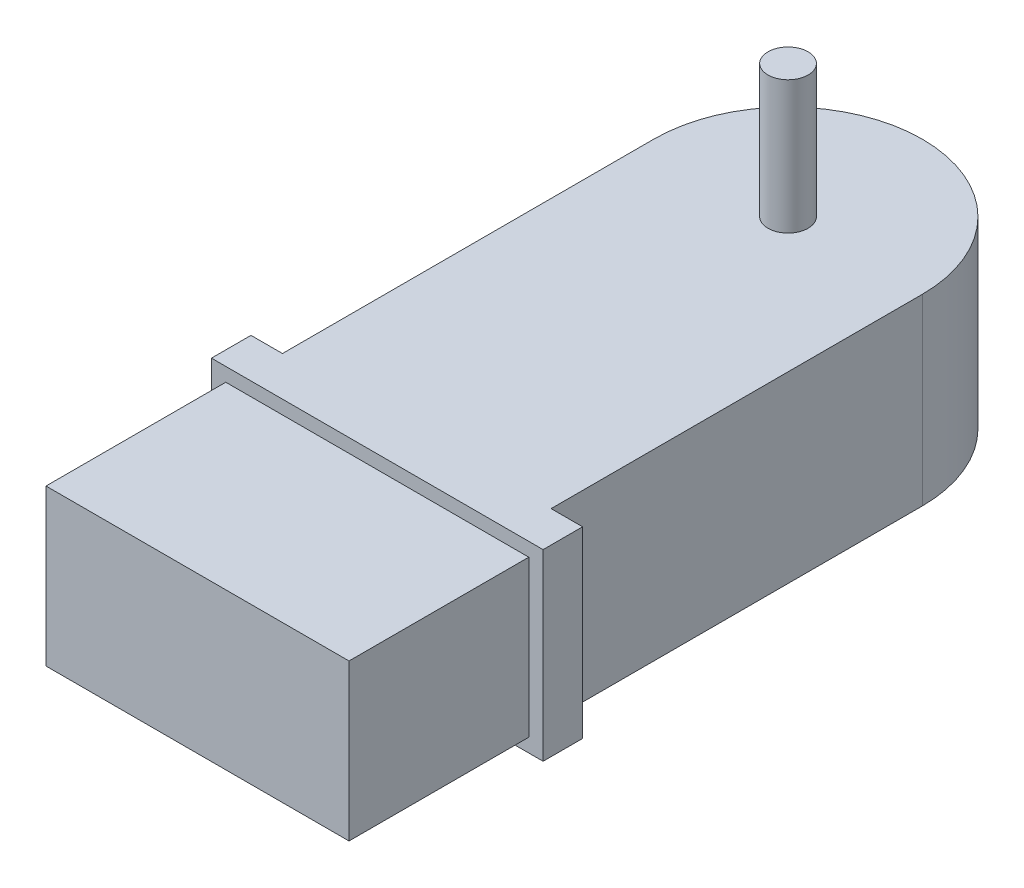
ISO-10303-21;
HEADER;
FILE_DESCRIPTION(('STEP AP214'),'2;1');
FILE_NAME('part.step','',(''),(''),'','','');
FILE_SCHEMA(('AUTOMOTIVE_DESIGN { 1 0 10303 214 1 1 1 1 }'));
ENDSEC;
DATA;
#1=APPLICATION_CONTEXT('core data for automotive mechanical design processes');
#2=APPLICATION_PROTOCOL_DEFINITION('international standard','automotive_design',2000,#1);
#3=PRODUCT_CONTEXT('',#1,'mechanical');
#4=PRODUCT('Part','Part','',(#3));
#5=PRODUCT_RELATED_PRODUCT_CATEGORY('part','',(#4));
#6=PRODUCT_DEFINITION_FORMATION('','',#4);
#7=PRODUCT_DEFINITION_CONTEXT('part definition',#1,'design');
#8=PRODUCT_DEFINITION('design','',#6,#7);
#9=PRODUCT_DEFINITION_SHAPE('','',#8);
#10=(LENGTH_UNIT() NAMED_UNIT(*) SI_UNIT(.MILLI.,.METRE.));
#11=(NAMED_UNIT(*) PLANE_ANGLE_UNIT() SI_UNIT($,.RADIAN.));
#12=(NAMED_UNIT(*) SI_UNIT($,.STERADIAN.) SOLID_ANGLE_UNIT());
#13=UNCERTAINTY_MEASURE_WITH_UNIT(LENGTH_MEASURE(1.E-05),#10,'distance_accuracy_value','');
#14=(GEOMETRIC_REPRESENTATION_CONTEXT(3) GLOBAL_UNCERTAINTY_ASSIGNED_CONTEXT((#13)) GLOBAL_UNIT_ASSIGNED_CONTEXT((#10,
#11,#12)) REPRESENTATION_CONTEXT('',''));
#15=CARTESIAN_POINT('',(0.,0.,0.));
#16=DIRECTION('',(0.,0.,1.));
#17=DIRECTION('',(1.,0.,0.));
#18=AXIS2_PLACEMENT_3D('',#15,#16,#17);
#19=CARTESIAN_POINT('',(0.,13.6779,0.));
#20=DIRECTION('',(0.,1.,0.));
#21=DIRECTION('',(0.,0.,1.));
#22=AXIS2_PLACEMENT_3D('',#19,#20,#21);
#23=PLANE('',#22);
#24=DIRECTION('',(0.,0.,1.));
#25=VECTOR('',#24,1.);
#26=CARTESIAN_POINT('',(-10.0203,13.6779,0.));
#27=LINE('',#26,#25);
#28=CARTESIAN_POINT('',(-10.0203,13.6779,-15.32255));
#29=VERTEX_POINT('',#28);
#30=CARTESIAN_POINT('',(-10.0203,13.6779,12.37615));
#31=VERTEX_POINT('',#30);
#32=EDGE_CURVE('E161',#29,#31,#27,.T.);
#33=ORIENTED_EDGE('',*,*,#32,.T.);
#34=DIRECTION('',(1.,0.,0.));
#35=VECTOR('',#34,1.);
#36=CARTESIAN_POINT('',(0.,13.6779,12.37615));
#37=LINE('',#36,#35);
#38=CARTESIAN_POINT('',(-12.3698,13.6779,12.37615));
#39=VERTEX_POINT('',#38);
#40=EDGE_CURVE('E163',#39,#31,#37,.T.);
#41=ORIENTED_EDGE('',*,*,#40,.F.);
#42=DIRECTION('',(0.,0.,-1.));
#43=VECTOR('',#42,1.);
#44=CARTESIAN_POINT('',(-12.3698,13.6779,0.));
#45=LINE('',#44,#43);
#46=CARTESIAN_POINT('',(-12.3698,13.6779,15.32255));
#47=VERTEX_POINT('',#46);
#48=EDGE_CURVE('E167',#47,#39,#45,.T.);
#49=ORIENTED_EDGE('',*,*,#48,.F.);
#50=DIRECTION('',(1.,0.,0.));
#51=VECTOR('',#50,1.);
#52=CARTESIAN_POINT('',(0.,13.6779,15.32255));
#53=LINE('',#52,#51);
#54=CARTESIAN_POINT('',(12.3698,13.6779,15.32255));
#55=VERTEX_POINT('',#54);
#56=EDGE_CURVE('E170',#47,#55,#53,.T.);
#57=ORIENTED_EDGE('',*,*,#56,.T.);
#58=DIRECTION('',(0.,0.,-1.));
#59=VECTOR('',#58,1.);
#60=CARTESIAN_POINT('',(12.3698,13.6779,0.));
#61=LINE('',#60,#59);
#62=CARTESIAN_POINT('',(12.3698,13.6779,12.37615));
#63=VERTEX_POINT('',#62);
#64=EDGE_CURVE('E172',#55,#63,#61,.T.);
#65=ORIENTED_EDGE('',*,*,#64,.T.);
#66=DIRECTION('',(1.,0.,0.));
#67=VECTOR('',#66,1.);
#68=CARTESIAN_POINT('',(0.,13.6779,12.37615));
#69=LINE('',#68,#67);
#70=CARTESIAN_POINT('',(10.0203,13.6779,12.37615));
#71=VERTEX_POINT('',#70);
#72=EDGE_CURVE('E174',#71,#63,#69,.T.);
#73=ORIENTED_EDGE('',*,*,#72,.F.);
#74=DIRECTION('',(0.,0.,1.));
#75=VECTOR('',#74,1.);
#76=CARTESIAN_POINT('',(10.0203,13.6779,0.));
#77=LINE('',#76,#75);
#78=CARTESIAN_POINT('',(10.0203,13.6779,-15.32255));
#79=VERTEX_POINT('',#78);
#80=EDGE_CURVE('E177',#79,#71,#77,.T.);
#81=ORIENTED_EDGE('',*,*,#80,.F.);
#82=CARTESIAN_POINT('',(0.,13.6779,-15.32255));
#83=DIRECTION('',(0.,1.,0.));
#84=DIRECTION('',(0.,0.,1.));
#85=AXIS2_PLACEMENT_3D('',#82,#83,#84);
#86=CIRCLE('',#85,10.0203);
#87=EDGE_CURVE('E180',#29,#79,#86,.F.);
#88=ORIENTED_EDGE('',*,*,#87,.F.);
#89=EDGE_LOOP('',(#33,#41,#49,#57,#65,#73,#81,#88));
#90=FACE_BOUND('',#89,.T.);
#91=CARTESIAN_POINT('',(0.,13.6779,-15.32255));
#92=DIRECTION('',(0.,1.,0.));
#93=DIRECTION('',(0.,0.,1.));
#94=AXIS2_PLACEMENT_3D('',#91,#92,#93);
#95=CIRCLE('',#94,1.4986);
#96=CARTESIAN_POINT('',(0.,13.6779,-13.82395));
#97=VERTEX_POINT('',#96);
#98=EDGE_CURVE('E425',#97,#97,#95,.T.);
#99=ORIENTED_EDGE('',*,*,#98,.F.);
#100=EDGE_LOOP('',(#99));
#101=FACE_BOUND('',#100,.T.);
#102=ADVANCED_FACE('F34',(#90,#101),#23,.T.);
#103=CARTESIAN_POINT('',(-10.0203,13.6779,0.));
#104=DIRECTION('',(1.,0.,0.));
#105=DIRECTION('',(0.,0.,-1.));
#106=AXIS2_PLACEMENT_3D('',#103,#104,#105);
#107=PLANE('',#106);
#108=DIRECTION('',(0.,0.,1.));
#109=VECTOR('',#108,1.);
#110=CARTESIAN_POINT('',(-10.0203,0.,0.));
#111=LINE('',#110,#109);
#112=CARTESIAN_POINT('',(-10.0203,0.,-15.32255));
#113=VERTEX_POINT('',#112);
#114=CARTESIAN_POINT('',(-10.0203,0.,12.37615));
#115=VERTEX_POINT('',#114);
#116=EDGE_CURVE('E129',#113,#115,#111,.T.);
#117=ORIENTED_EDGE('',*,*,#116,.T.);
#118=DIRECTION('',(0.,-1.,0.));
#119=VECTOR('',#118,1.);
#120=CARTESIAN_POINT('',(-10.0203,13.6779,12.37615));
#121=LINE('',#120,#119);
#122=EDGE_CURVE('E11',#31,#115,#121,.T.);
#123=ORIENTED_EDGE('',*,*,#122,.F.);
#124=ORIENTED_EDGE('',*,*,#32,.F.);
#125=DIRECTION('',(0.,-1.,0.));
#126=VECTOR('',#125,1.);
#127=CARTESIAN_POINT('',(-10.0203,13.6779,-15.32255));
#128=LINE('',#127,#126);
#129=EDGE_CURVE('E183',#29,#113,#128,.T.);
#130=ORIENTED_EDGE('',*,*,#129,.T.);
#131=EDGE_LOOP('',(#117,#123,#124,#130));
#132=FACE_BOUND('',#131,.T.);
#133=ADVANCED_FACE('F36',(#132),#107,.F.);
#134=CARTESIAN_POINT('',(0.,13.6779,12.37615));
#135=DIRECTION('',(0.,0.,-1.));
#136=DIRECTION('',(-1.,0.,0.));
#137=AXIS2_PLACEMENT_3D('',#134,#135,#136);
#138=PLANE('',#137);
#139=DIRECTION('',(1.,0.,0.));
#140=VECTOR('',#139,1.);
#141=CARTESIAN_POINT('',(0.,0.,12.37615));
#142=LINE('',#141,#140);
#143=CARTESIAN_POINT('',(-12.3698,0.,12.37615));
#144=VERTEX_POINT('',#143);
#145=EDGE_CURVE('E186',#144,#115,#142,.T.);
#146=ORIENTED_EDGE('',*,*,#145,.F.);
#147=DIRECTION('',(0.,-1.,0.));
#148=VECTOR('',#147,1.);
#149=CARTESIAN_POINT('',(-12.3698,13.6779,12.37615));
#150=LINE('',#149,#148);
#151=EDGE_CURVE('E42',#39,#144,#150,.T.);
#152=ORIENTED_EDGE('',*,*,#151,.F.);
#153=ORIENTED_EDGE('',*,*,#40,.T.);
#154=ORIENTED_EDGE('',*,*,#122,.T.);
#155=EDGE_LOOP('',(#146,#152,#153,#154));
#156=FACE_BOUND('',#155,.T.);
#157=ADVANCED_FACE('F223',(#156),#138,.T.);
#158=CARTESIAN_POINT('',(-12.3698,13.6779,0.));
#159=DIRECTION('',(-1.,0.,0.));
#160=DIRECTION('',(0.,0.,1.));
#161=AXIS2_PLACEMENT_3D('',#158,#159,#160);
#162=PLANE('',#161);
#163=DIRECTION('',(0.,0.,-1.));
#164=VECTOR('',#163,1.);
#165=CARTESIAN_POINT('',(-12.3698,0.,0.));
#166=LINE('',#165,#164);
#167=CARTESIAN_POINT('',(-12.3698,0.,15.32255));
#168=VERTEX_POINT('',#167);
#169=EDGE_CURVE('E189',#168,#144,#166,.T.);
#170=ORIENTED_EDGE('',*,*,#169,.F.);
#171=DIRECTION('',(0.,-1.,0.));
#172=VECTOR('',#171,1.);
#173=CARTESIAN_POINT('',(-12.3698,13.6779,15.32255));
#174=LINE('',#173,#172);
#175=EDGE_CURVE('E215',#47,#168,#174,.T.);
#176=ORIENTED_EDGE('',*,*,#175,.F.);
#177=ORIENTED_EDGE('',*,*,#48,.T.);
#178=ORIENTED_EDGE('',*,*,#151,.T.);
#179=EDGE_LOOP('',(#170,#176,#177,#178));
#180=FACE_BOUND('',#179,.T.);
#181=ADVANCED_FACE('F219',(#180),#162,.T.);
#182=CARTESIAN_POINT('',(0.,13.6779,15.32255));
#183=DIRECTION('',(0.,0.,-1.));
#184=DIRECTION('',(-1.,0.,0.));
#185=AXIS2_PLACEMENT_3D('',#182,#183,#184);
#186=PLANE('',#185);
#187=DIRECTION('',(1.,0.,0.));
#188=VECTOR('',#187,1.);
#189=CARTESIAN_POINT('',(0.,12.65555,15.32255));
#190=LINE('',#189,#188);
#191=CARTESIAN_POINT('',(-11.303,12.65555,15.32255));
#192=VERTEX_POINT('',#191);
#193=CARTESIAN_POINT('',(11.303,12.65555,15.32255));
#194=VERTEX_POINT('',#193);
#195=EDGE_CURVE('E49',#192,#194,#190,.T.);
#196=ORIENTED_EDGE('',*,*,#195,.T.);
#197=DIRECTION('',(0.,-1.,0.));
#198=VECTOR('',#197,1.);
#199=CARTESIAN_POINT('',(11.303,0.,15.32255));
#200=LINE('',#199,#198);
#201=CARTESIAN_POINT('',(11.303,1.02235,15.32255));
#202=VERTEX_POINT('',#201);
#203=EDGE_CURVE('E126',#194,#202,#200,.T.);
#204=ORIENTED_EDGE('',*,*,#203,.T.);
#205=DIRECTION('',(1.,0.,0.));
#206=VECTOR('',#205,1.);
#207=CARTESIAN_POINT('',(0.,1.02235,15.32255));
#208=LINE('',#207,#206);
#209=CARTESIAN_POINT('',(-11.303,1.02235,15.32255));
#210=VERTEX_POINT('',#209);
#211=EDGE_CURVE('E139',#210,#202,#208,.T.);
#212=ORIENTED_EDGE('',*,*,#211,.F.);
#213=DIRECTION('',(0.,-1.,0.));
#214=VECTOR('',#213,1.);
#215=CARTESIAN_POINT('',(-11.303,0.,15.32255));
#216=LINE('',#215,#214);
#217=EDGE_CURVE('E54',#192,#210,#216,.T.);
#218=ORIENTED_EDGE('',*,*,#217,.F.);
#219=EDGE_LOOP('',(#196,#204,#212,#218));
#220=FACE_BOUND('',#219,.T.);
#221=DIRECTION('',(1.,0.,0.));
#222=VECTOR('',#221,1.);
#223=CARTESIAN_POINT('',(0.,0.,15.32255));
#224=LINE('',#223,#222);
#225=CARTESIAN_POINT('',(12.3698,0.,15.32255));
#226=VERTEX_POINT('',#225);
#227=EDGE_CURVE('E192',#168,#226,#224,.T.);
#228=ORIENTED_EDGE('',*,*,#227,.T.);
#229=DIRECTION('',(0.,-1.,0.));
#230=VECTOR('',#229,1.);
#231=CARTESIAN_POINT('',(12.3698,13.6779,15.32255));
#232=LINE('',#231,#230);
#233=EDGE_CURVE('E212',#55,#226,#232,.T.);
#234=ORIENTED_EDGE('',*,*,#233,.F.);
#235=ORIENTED_EDGE('',*,*,#56,.F.);
#236=ORIENTED_EDGE('',*,*,#175,.T.);
#237=EDGE_LOOP('',(#228,#234,#235,#236));
#238=FACE_BOUND('',#237,.T.);
#239=ADVANCED_FACE('F232',(#220,#238),#186,.F.);
#240=CARTESIAN_POINT('',(12.3698,13.6779,0.));
#241=DIRECTION('',(-1.,0.,0.));
#242=DIRECTION('',(0.,0.,1.));
#243=AXIS2_PLACEMENT_3D('',#240,#241,#242);
#244=PLANE('',#243);
#245=DIRECTION('',(0.,0.,-1.));
#246=VECTOR('',#245,1.);
#247=CARTESIAN_POINT('',(12.3698,0.,0.));
#248=LINE('',#247,#246);
#249=CARTESIAN_POINT('',(12.3698,0.,12.37615));
#250=VERTEX_POINT('',#249);
#251=EDGE_CURVE('E194',#226,#250,#248,.T.);
#252=ORIENTED_EDGE('',*,*,#251,.T.);
#253=DIRECTION('',(0.,-1.,0.));
#254=VECTOR('',#253,1.);
#255=CARTESIAN_POINT('',(12.3698,13.6779,12.37615));
#256=LINE('',#255,#254);
#257=EDGE_CURVE('E210',#63,#250,#256,.T.);
#258=ORIENTED_EDGE('',*,*,#257,.F.);
#259=ORIENTED_EDGE('',*,*,#64,.F.);
#260=ORIENTED_EDGE('',*,*,#233,.T.);
#261=EDGE_LOOP('',(#252,#258,#259,#260));
#262=FACE_BOUND('',#261,.T.);
#263=ADVANCED_FACE('F236',(#262),#244,.F.);
#264=CARTESIAN_POINT('',(0.,13.6779,12.37615));
#265=DIRECTION('',(0.,0.,-1.));
#266=DIRECTION('',(-1.,0.,0.));
#267=AXIS2_PLACEMENT_3D('',#264,#265,#266);
#268=PLANE('',#267);
#269=DIRECTION('',(1.,0.,0.));
#270=VECTOR('',#269,1.);
#271=CARTESIAN_POINT('',(0.,0.,12.37615));
#272=LINE('',#271,#270);
#273=CARTESIAN_POINT('',(10.0203,0.,12.37615));
#274=VERTEX_POINT('',#273);
#275=EDGE_CURVE('E197',#274,#250,#272,.T.);
#276=ORIENTED_EDGE('',*,*,#275,.F.);
#277=DIRECTION('',(0.,-1.,0.));
#278=VECTOR('',#277,1.);
#279=CARTESIAN_POINT('',(10.0203,13.6779,12.37615));
#280=LINE('',#279,#278);
#281=EDGE_CURVE('E208',#71,#274,#280,.T.);
#282=ORIENTED_EDGE('',*,*,#281,.F.);
#283=ORIENTED_EDGE('',*,*,#72,.T.);
#284=ORIENTED_EDGE('',*,*,#257,.T.);
#285=EDGE_LOOP('',(#276,#282,#283,#284));
#286=FACE_BOUND('',#285,.T.);
#287=ADVANCED_FACE('F253',(#286),#268,.T.);
#288=CARTESIAN_POINT('',(10.0203,13.6779,0.));
#289=DIRECTION('',(1.,0.,0.));
#290=DIRECTION('',(0.,0.,-1.));
#291=AXIS2_PLACEMENT_3D('',#288,#289,#290);
#292=PLANE('',#291);
#293=DIRECTION('',(0.,0.,1.));
#294=VECTOR('',#293,1.);
#295=CARTESIAN_POINT('',(10.0203,0.,0.));
#296=LINE('',#295,#294);
#297=CARTESIAN_POINT('',(10.0203,0.,-15.32255));
#298=VERTEX_POINT('',#297);
#299=EDGE_CURVE('E200',#298,#274,#296,.T.);
#300=ORIENTED_EDGE('',*,*,#299,.F.);
#301=DIRECTION('',(0.,-1.,0.));
#302=VECTOR('',#301,1.);
#303=CARTESIAN_POINT('',(10.0203,13.6779,-15.32255));
#304=LINE('',#303,#302);
#305=EDGE_CURVE('E206',#79,#298,#304,.T.);
#306=ORIENTED_EDGE('',*,*,#305,.F.);
#307=ORIENTED_EDGE('',*,*,#80,.T.);
#308=ORIENTED_EDGE('',*,*,#281,.T.);
#309=EDGE_LOOP('',(#300,#306,#307,#308));
#310=FACE_BOUND('',#309,.T.);
#311=ADVANCED_FACE('F250',(#310),#292,.T.);
#312=CARTESIAN_POINT('',(0.,13.6779,-15.32255));
#313=DIRECTION('',(0.,-1.,0.));
#314=DIRECTION('',(0.,0.,-1.));
#315=AXIS2_PLACEMENT_3D('',#312,#313,#314);
#316=CYLINDRICAL_SURFACE('',#315,10.0203);
#317=CARTESIAN_POINT('',(0.,0.,-15.32255));
#318=DIRECTION('',(0.,1.,0.));
#319=DIRECTION('',(0.,0.,1.));
#320=AXIS2_PLACEMENT_3D('',#317,#318,#319);
#321=CIRCLE('',#320,10.0203);
#322=EDGE_CURVE('E164',#113,#298,#321,.F.);
#323=ORIENTED_EDGE('',*,*,#322,.F.);
#324=ORIENTED_EDGE('',*,*,#129,.F.);
#325=ORIENTED_EDGE('',*,*,#87,.T.);
#326=ORIENTED_EDGE('',*,*,#305,.T.);
#327=EDGE_LOOP('',(#323,#324,#325,#326));
#328=FACE_BOUND('',#327,.T.);
#329=ADVANCED_FACE('F247',(#328),#316,.T.);
#330=CARTESIAN_POINT('',(0.,0.,0.));
#331=DIRECTION('',(0.,1.,0.));
#332=DIRECTION('',(0.,0.,1.));
#333=AXIS2_PLACEMENT_3D('',#330,#331,#332);
#334=PLANE('',#333);
#335=ORIENTED_EDGE('',*,*,#116,.F.);
#336=ORIENTED_EDGE('',*,*,#322,.T.);
#337=ORIENTED_EDGE('',*,*,#299,.T.);
#338=ORIENTED_EDGE('',*,*,#275,.T.);
#339=ORIENTED_EDGE('',*,*,#251,.F.);
#340=ORIENTED_EDGE('',*,*,#227,.F.);
#341=ORIENTED_EDGE('',*,*,#169,.T.);
#342=ORIENTED_EDGE('',*,*,#145,.T.);
#343=EDGE_LOOP('',(#335,#336,#337,#338,#339,#340,#341,#342));
#344=FACE_BOUND('',#343,.T.);
#345=ADVANCED_FACE('F228',(#344),#334,.F.);
#346=CARTESIAN_POINT('',(11.303,0.,28.73375));
#347=DIRECTION('',(1.,0.,0.));
#348=DIRECTION('',(0.,1.,0.));
#349=AXIS2_PLACEMENT_3D('',#346,#347,#348);
#350=PLANE('',#349);
#351=ORIENTED_EDGE('',*,*,#203,.F.);
#352=DIRECTION('',(0.,0.,-1.));
#353=VECTOR('',#352,1.);
#354=CARTESIAN_POINT('',(11.303,12.65555,28.73375));
#355=LINE('',#354,#353);
#356=CARTESIAN_POINT('',(11.303,12.65555,28.73375));
#357=VERTEX_POINT('',#356);
#358=EDGE_CURVE('E121',#357,#194,#355,.T.);
#359=ORIENTED_EDGE('',*,*,#358,.F.);
#360=DIRECTION('',(0.,-1.,0.));
#361=VECTOR('',#360,1.);
#362=CARTESIAN_POINT('',(11.303,0.,28.73375));
#363=LINE('',#362,#361);
#364=CARTESIAN_POINT('',(11.303,1.02235,28.73375));
#365=VERTEX_POINT('',#364);
#366=EDGE_CURVE('E125',#357,#365,#363,.T.);
#367=ORIENTED_EDGE('',*,*,#366,.T.);
#368=DIRECTION('',(0.,0.,-1.));
#369=VECTOR('',#368,1.);
#370=CARTESIAN_POINT('',(11.303,1.02235,28.73375));
#371=LINE('',#370,#369);
#372=EDGE_CURVE('E149',#365,#202,#371,.T.);
#373=ORIENTED_EDGE('',*,*,#372,.T.);
#374=EDGE_LOOP('',(#351,#359,#367,#373));
#375=FACE_BOUND('',#374,.T.);
#376=ADVANCED_FACE('F123',(#375),#350,.T.);
#377=CARTESIAN_POINT('',(0.,12.65555,28.73375));
#378=DIRECTION('',(0.,1.,0.));
#379=DIRECTION('',(0.,0.,1.));
#380=AXIS2_PLACEMENT_3D('',#377,#378,#379);
#381=PLANE('',#380);
#382=ORIENTED_EDGE('',*,*,#195,.F.);
#383=DIRECTION('',(0.,0.,-1.));
#384=VECTOR('',#383,1.);
#385=CARTESIAN_POINT('',(-11.303,12.65555,28.73375));
#386=LINE('',#385,#384);
#387=CARTESIAN_POINT('',(-11.303,12.65555,28.73375));
#388=VERTEX_POINT('',#387);
#389=EDGE_CURVE('E130',#388,#192,#386,.T.);
#390=ORIENTED_EDGE('',*,*,#389,.F.);
#391=DIRECTION('',(1.,0.,0.));
#392=VECTOR('',#391,1.);
#393=CARTESIAN_POINT('',(0.,12.65555,28.73375));
#394=LINE('',#393,#392);
#395=EDGE_CURVE('E135',#388,#357,#394,.T.);
#396=ORIENTED_EDGE('',*,*,#395,.T.);
#397=ORIENTED_EDGE('',*,*,#358,.T.);
#398=EDGE_LOOP('',(#382,#390,#396,#397));
#399=FACE_BOUND('',#398,.T.);
#400=ADVANCED_FACE('F141',(#399),#381,.T.);
#401=CARTESIAN_POINT('',(-11.303,0.,28.73375));
#402=DIRECTION('',(1.,0.,0.));
#403=DIRECTION('',(0.,1.,0.));
#404=AXIS2_PLACEMENT_3D('',#401,#402,#403);
#405=PLANE('',#404);
#406=ORIENTED_EDGE('',*,*,#217,.T.);
#407=DIRECTION('',(0.,0.,-1.));
#408=VECTOR('',#407,1.);
#409=CARTESIAN_POINT('',(-11.303,1.02235,28.73375));
#410=LINE('',#409,#408);
#411=CARTESIAN_POINT('',(-11.303,1.02235,28.73375));
#412=VERTEX_POINT('',#411);
#413=EDGE_CURVE('E157',#412,#210,#410,.T.);
#414=ORIENTED_EDGE('',*,*,#413,.F.);
#415=DIRECTION('',(0.,-1.,0.));
#416=VECTOR('',#415,1.);
#417=CARTESIAN_POINT('',(-11.303,0.,28.73375));
#418=LINE('',#417,#416);
#419=EDGE_CURVE('E143',#388,#412,#418,.T.);
#420=ORIENTED_EDGE('',*,*,#419,.F.);
#421=ORIENTED_EDGE('',*,*,#389,.T.);
#422=EDGE_LOOP('',(#406,#414,#420,#421));
#423=FACE_BOUND('',#422,.T.);
#424=ADVANCED_FACE('F293',(#423),#405,.F.);
#425=CARTESIAN_POINT('',(0.,1.02235,28.73375));
#426=DIRECTION('',(0.,1.,0.));
#427=DIRECTION('',(0.,0.,1.));
#428=AXIS2_PLACEMENT_3D('',#425,#426,#427);
#429=PLANE('',#428);
#430=ORIENTED_EDGE('',*,*,#211,.T.);
#431=ORIENTED_EDGE('',*,*,#372,.F.);
#432=DIRECTION('',(1.,0.,0.));
#433=VECTOR('',#432,1.);
#434=CARTESIAN_POINT('',(0.,1.02235,28.73375));
#435=LINE('',#434,#433);
#436=EDGE_CURVE('E137',#412,#365,#435,.T.);
#437=ORIENTED_EDGE('',*,*,#436,.F.);
#438=ORIENTED_EDGE('',*,*,#413,.T.);
#439=EDGE_LOOP('',(#430,#431,#437,#438));
#440=FACE_BOUND('',#439,.T.);
#441=ADVANCED_FACE('F299',(#440),#429,.F.);
#442=CARTESIAN_POINT('',(0.,0.,28.73375));
#443=DIRECTION('',(0.,0.,1.));
#444=DIRECTION('',(1.,0.,0.));
#445=AXIS2_PLACEMENT_3D('',#442,#443,#444);
#446=PLANE('',#445);
#447=ORIENTED_EDGE('',*,*,#366,.F.);
#448=ORIENTED_EDGE('',*,*,#395,.F.);
#449=ORIENTED_EDGE('',*,*,#419,.T.);
#450=ORIENTED_EDGE('',*,*,#436,.T.);
#451=EDGE_LOOP('',(#447,#448,#449,#450));
#452=FACE_BOUND('',#451,.T.);
#453=ADVANCED_FACE('F134',(#452),#446,.T.);
#454=CARTESIAN_POINT('',(0.,23.5839,-15.32255));
#455=DIRECTION('',(0.,-1.,0.));
#456=DIRECTION('',(0.,0.,-1.));
#457=AXIS2_PLACEMENT_3D('',#454,#455,#456);
#458=CYLINDRICAL_SURFACE('',#457,1.4986);
#459=CARTESIAN_POINT('',(0.,23.5839,-15.32255));
#460=DIRECTION('',(0.,1.,0.));
#461=DIRECTION('',(0.,0.,1.));
#462=AXIS2_PLACEMENT_3D('',#459,#460,#461);
#463=CIRCLE('',#462,1.4986);
#464=CARTESIAN_POINT('',(0.,23.5839,-13.82395));
#465=VERTEX_POINT('',#464);
#466=EDGE_CURVE('E151',#465,#465,#463,.T.);
#467=ORIENTED_EDGE('',*,*,#466,.F.);
#468=EDGE_LOOP('',(#467));
#469=FACE_BOUND('',#468,.T.);
#470=ORIENTED_EDGE('',*,*,#98,.T.);
#471=EDGE_LOOP('',(#470));
#472=FACE_BOUND('',#471,.T.);
#473=ADVANCED_FACE('F314',(#469,#472),#458,.T.);
#474=CARTESIAN_POINT('',(0.,23.5839,0.));
#475=DIRECTION('',(0.,1.,0.));
#476=DIRECTION('',(0.,0.,1.));
#477=AXIS2_PLACEMENT_3D('',#474,#475,#476);
#478=PLANE('',#477);
#479=ORIENTED_EDGE('',*,*,#466,.T.);
#480=EDGE_LOOP('',(#479));
#481=FACE_BOUND('',#480,.T.);
#482=ADVANCED_FACE('F321',(#481),#478,.T.);
#483=CLOSED_SHELL('',(#102,#133,#157,#181,#239,#263,#287,#311,#329,#345,#376,#400,#424,#441,
#453,#473,#482));
#484=MANIFOLD_SOLID_BREP('B2',#483);
#485=ADVANCED_BREP_SHAPE_REPRESENTATION('',(#18,#484),#14);
#486=SHAPE_DEFINITION_REPRESENTATION(#9,#485);
ENDSEC;
END-ISO-10303-21;
